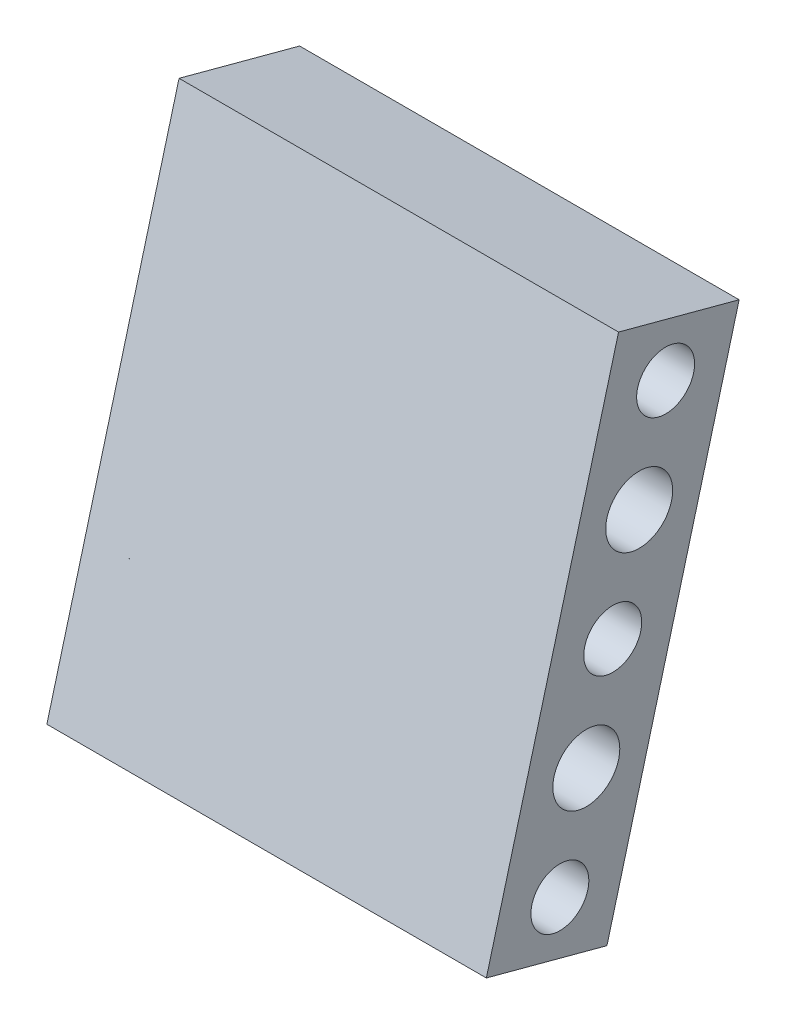
ISO-10303-21;
HEADER;
FILE_DESCRIPTION(('STEP AP214'),'2;1');
FILE_NAME('part.step','',(''),(''),'','','');
FILE_SCHEMA(('AUTOMOTIVE_DESIGN { 1 0 10303 214 1 1 1 1 }'));
ENDSEC;
DATA;
#1=APPLICATION_CONTEXT('core data for automotive mechanical design processes');
#2=APPLICATION_PROTOCOL_DEFINITION('international standard','automotive_design',2000,#1);
#3=PRODUCT_CONTEXT('',#1,'mechanical');
#4=PRODUCT('Part','Part','',(#3));
#5=PRODUCT_RELATED_PRODUCT_CATEGORY('part','',(#4));
#6=PRODUCT_DEFINITION_FORMATION('','',#4);
#7=PRODUCT_DEFINITION_CONTEXT('part definition',#1,'design');
#8=PRODUCT_DEFINITION('design','',#6,#7);
#9=PRODUCT_DEFINITION_SHAPE('','',#8);
#10=(LENGTH_UNIT() NAMED_UNIT(*) SI_UNIT(.MILLI.,.METRE.));
#11=(NAMED_UNIT(*) PLANE_ANGLE_UNIT() SI_UNIT($,.RADIAN.));
#12=(NAMED_UNIT(*) SI_UNIT($,.STERADIAN.) SOLID_ANGLE_UNIT());
#13=UNCERTAINTY_MEASURE_WITH_UNIT(LENGTH_MEASURE(1.E-05),#10,'distance_accuracy_value','');
#14=(GEOMETRIC_REPRESENTATION_CONTEXT(3) GLOBAL_UNCERTAINTY_ASSIGNED_CONTEXT((#13)) GLOBAL_UNIT_ASSIGNED_CONTEXT((#10,
#11,#12)) REPRESENTATION_CONTEXT('',''));
#15=CARTESIAN_POINT('',(0.,0.,0.));
#16=DIRECTION('',(0.,0.,1.));
#17=DIRECTION('',(1.,0.,0.));
#18=AXIS2_PLACEMENT_3D('',#15,#16,#17);
#19=CARTESIAN_POINT('',(19.3625,0.,0.));
#20=DIRECTION('',(-1.,0.,0.));
#21=DIRECTION('',(0.,0.,1.));
#22=AXIS2_PLACEMENT_3D('',#19,#20,#21);
#23=PLANE('',#22);
#24=CARTESIAN_POINT('',(19.3625,114.062981758306,-27.0267796246542));
#25=DIRECTION('',(1.,0.,0.));
#26=DIRECTION('',(0.,0.,-1.));
#27=AXIS2_PLACEMENT_3D('',#24,#25,#26);
#28=CIRCLE('',#27,2.55269999999999);
#29=CARTESIAN_POINT('',(19.3625,114.062981758306,-29.5794796246542));
#30=VERTEX_POINT('',#29);
#31=EDGE_CURVE('E143',#30,#30,#28,.T.);
#32=ORIENTED_EDGE('',*,*,#31,.F.);
#33=EDGE_LOOP('',(#32));
#34=FACE_BOUND('',#33,.T.);
#35=CARTESIAN_POINT('',(19.3625,96.6763168851028,-22.3680368128088));
#36=DIRECTION('',(1.,0.,0.));
#37=DIRECTION('',(0.,0.,-1.));
#38=AXIS2_PLACEMENT_3D('',#35,#36,#37);
#39=CIRCLE('',#38,2.55269999999999);
#40=CARTESIAN_POINT('',(19.3625,96.6763168851028,-24.9207368128088));
#41=VERTEX_POINT('',#40);
#42=EDGE_CURVE('E149',#41,#41,#39,.T.);
#43=ORIENTED_EDGE('',*,*,#42,.F.);
#44=EDGE_LOOP('',(#43));
#45=FACE_BOUND('',#44,.T.);
#46=CARTESIAN_POINT('',(19.3625,79.2896520118996,-17.7092940009634));
#47=DIRECTION('',(1.,0.,0.));
#48=DIRECTION('',(0.,0.,-1.));
#49=AXIS2_PLACEMENT_3D('',#46,#47,#48);
#50=CIRCLE('',#49,2.55269999999999);
#51=CARTESIAN_POINT('',(19.3625,79.2896520118996,-20.2619940009634));
#52=VERTEX_POINT('',#51);
#53=EDGE_CURVE('E155',#52,#52,#50,.T.);
#54=ORIENTED_EDGE('',*,*,#53,.F.);
#55=EDGE_LOOP('',(#54));
#56=FACE_BOUND('',#55,.T.);
#57=DIRECTION('',(0.,0.965925826289068,-0.258819045102521));
#58=VECTOR('',#57,1.);
#59=CARTESIAN_POINT('',(19.3625,76.3664905416626,-11.2320162534122));
#60=LINE('',#59,#58);
#61=CARTESIAN_POINT('',(19.3625,76.3664905416626,-11.2320162534122));
#62=VERTEX_POINT('',#61);
#63=CARTESIAN_POINT('',(19.3625,119.833152724671,-22.8788732830256));
#64=VERTEX_POINT('',#63);
#65=EDGE_CURVE('E162',#62,#64,#60,.T.);
#66=ORIENTED_EDGE('',*,*,#65,.F.);
#67=DIRECTION('',(0.,0.258819045102523,0.965925826289068));
#68=VECTOR('',#67,1.);
#69=CARTESIAN_POINT('',(19.3625,73.5194810455349,-21.857200342592));
#70=LINE('',#69,#68);
#71=CARTESIAN_POINT('',(19.3625,73.5194810455349,-21.857200342592));
#72=VERTEX_POINT('',#71);
#73=EDGE_CURVE('E169',#72,#62,#70,.T.);
#74=ORIENTED_EDGE('',*,*,#73,.F.);
#75=DIRECTION('',(0.,-0.965925826289068,0.258819045102521));
#76=VECTOR('',#75,1.);
#77=CARTESIAN_POINT('',(19.3625,116.986143228543,-33.5040573722054));
#78=LINE('',#77,#76);
#79=CARTESIAN_POINT('',(19.3625,116.986143228543,-33.5040573722054));
#80=VERTEX_POINT('',#79);
#81=EDGE_CURVE('E167',#80,#72,#78,.T.);
#82=ORIENTED_EDGE('',*,*,#81,.F.);
#83=DIRECTION('',(0.,-0.258819045102521,-0.965925826289068));
#84=VECTOR('',#83,1.);
#85=CARTESIAN_POINT('',(19.3625,119.833152724671,-22.8788732830256));
#86=LINE('',#85,#84);
#87=EDGE_CURVE('E164',#64,#80,#86,.T.);
#88=ORIENTED_EDGE('',*,*,#87,.F.);
#89=EDGE_LOOP('',(#66,#74,#82,#88));
#90=FACE_BOUND('',#89,.T.);
#91=CARTESIAN_POINT('',(19.3625,87.9829844485012,-20.0386654068861));
#92=DIRECTION('',(1.,0.,0.));
#93=DIRECTION('',(0.,0.,-1.));
#94=AXIS2_PLACEMENT_3D('',#91,#92,#93);
#95=CIRCLE('',#94,2.94999999999999);
#96=CARTESIAN_POINT('',(19.3625,87.9829844485012,-22.9886654068861));
#97=VERTEX_POINT('',#96);
#98=EDGE_CURVE('E197',#97,#97,#95,.T.);
#99=ORIENTED_EDGE('',*,*,#98,.F.);
#100=EDGE_LOOP('',(#99));
#101=FACE_BOUND('',#100,.T.);
#102=CARTESIAN_POINT('',(19.3625,105.369649321704,-24.6974082187315));
#103=DIRECTION('',(1.,0.,0.));
#104=DIRECTION('',(0.,0.,-1.));
#105=AXIS2_PLACEMENT_3D('',#102,#103,#104);
#106=CIRCLE('',#105,2.94999999999999);
#107=CARTESIAN_POINT('',(19.3625,105.369649321704,-27.6474082187315));
#108=VERTEX_POINT('',#107);
#109=EDGE_CURVE('E200',#108,#108,#106,.T.);
#110=ORIENTED_EDGE('',*,*,#109,.F.);
#111=EDGE_LOOP('',(#110));
#112=FACE_BOUND('',#111,.T.);
#113=ADVANCED_FACE('F49',(#34,#45,#56,#90,#101,#112),#23,.F.);
#114=CARTESIAN_POINT('',(19.3625,76.3664905416626,-11.2320162534122));
#115=DIRECTION('',(0.,0.258819045102521,0.965925826289068));
#116=DIRECTION('',(0.,-0.965925826289068,0.258819045102521));
#117=AXIS2_PLACEMENT_3D('',#114,#115,#116);
#118=PLANE('',#117);
#119=DIRECTION('',(0.,0.965925826289068,-0.258819045102521));
#120=VECTOR('',#119,1.);
#121=CARTESIAN_POINT('',(-19.3625,76.3664905416626,-11.2320162534122));
#122=LINE('',#121,#120);
#123=CARTESIAN_POINT('',(-19.3625,76.3664905416626,-11.2320162534122));
#124=VERTEX_POINT('',#123);
#125=CARTESIAN_POINT('',(-19.3625,119.833152724671,-22.8788732830256));
#126=VERTEX_POINT('',#125);
#127=EDGE_CURVE('E161',#124,#126,#122,.T.);
#128=ORIENTED_EDGE('',*,*,#127,.F.);
#129=DIRECTION('',(-1.,0.,0.));
#130=VECTOR('',#129,1.);
#131=CARTESIAN_POINT('',(19.3625,76.3664905416626,-11.2320162534122));
#132=LINE('',#131,#130);
#133=EDGE_CURVE('E11',#62,#124,#132,.T.);
#134=ORIENTED_EDGE('',*,*,#133,.F.);
#135=ORIENTED_EDGE('',*,*,#65,.T.);
#136=DIRECTION('',(-1.,0.,0.));
#137=VECTOR('',#136,1.);
#138=CARTESIAN_POINT('',(19.3625,119.833152724671,-22.8788732830256));
#139=LINE('',#138,#137);
#140=EDGE_CURVE('E94',#64,#126,#139,.T.);
#141=ORIENTED_EDGE('',*,*,#140,.T.);
#142=EDGE_LOOP('',(#128,#134,#135,#141));
#143=FACE_BOUND('',#142,.T.);
#144=ADVANCED_FACE('F51',(#143),#118,.T.);
#145=CARTESIAN_POINT('',(19.3625,73.5194810455349,-21.857200342592));
#146=DIRECTION('',(0.,-0.965925826289068,0.258819045102523));
#147=DIRECTION('',(0.,-0.258819045102523,-0.965925826289068));
#148=AXIS2_PLACEMENT_3D('',#145,#146,#147);
#149=PLANE('',#148);
#150=DIRECTION('',(0.,0.258819045102523,0.965925826289068));
#151=VECTOR('',#150,1.);
#152=CARTESIAN_POINT('',(-19.3625,73.5194810455349,-21.857200342592));
#153=LINE('',#152,#151);
#154=CARTESIAN_POINT('',(-19.3625,73.5194810455349,-21.857200342592));
#155=VERTEX_POINT('',#154);
#156=EDGE_CURVE('E165',#155,#124,#153,.T.);
#157=ORIENTED_EDGE('',*,*,#156,.F.);
#158=DIRECTION('',(-1.,0.,0.));
#159=VECTOR('',#158,1.);
#160=CARTESIAN_POINT('',(19.3625,73.5194810455349,-21.857200342592));
#161=LINE('',#160,#159);
#162=EDGE_CURVE('E59',#72,#155,#161,.T.);
#163=ORIENTED_EDGE('',*,*,#162,.F.);
#164=ORIENTED_EDGE('',*,*,#73,.T.);
#165=ORIENTED_EDGE('',*,*,#133,.T.);
#166=EDGE_LOOP('',(#157,#163,#164,#165));
#167=FACE_BOUND('',#166,.T.);
#168=ADVANCED_FACE('F185',(#167),#149,.T.);
#169=CARTESIAN_POINT('',(19.3625,116.986143228543,-33.5040573722054));
#170=DIRECTION('',(0.,-0.258819045102521,-0.965925826289068));
#171=DIRECTION('',(0.,0.965925826289068,-0.258819045102521));
#172=AXIS2_PLACEMENT_3D('',#169,#170,#171);
#173=PLANE('',#172);
#174=DIRECTION('',(0.,-0.965925826289068,0.258819045102521));
#175=VECTOR('',#174,1.);
#176=CARTESIAN_POINT('',(-19.3625,116.986143228543,-33.5040573722054));
#177=LINE('',#176,#175);
#178=CARTESIAN_POINT('',(-19.3625,116.986143228543,-33.5040573722054));
#179=VERTEX_POINT('',#178);
#180=EDGE_CURVE('E176',#179,#155,#177,.T.);
#181=ORIENTED_EDGE('',*,*,#180,.F.);
#182=DIRECTION('',(-1.,0.,0.));
#183=VECTOR('',#182,1.);
#184=CARTESIAN_POINT('',(19.3625,116.986143228543,-33.5040573722054));
#185=LINE('',#184,#183);
#186=EDGE_CURVE('E181',#80,#179,#185,.T.);
#187=ORIENTED_EDGE('',*,*,#186,.F.);
#188=ORIENTED_EDGE('',*,*,#81,.T.);
#189=ORIENTED_EDGE('',*,*,#162,.T.);
#190=EDGE_LOOP('',(#181,#187,#188,#189));
#191=FACE_BOUND('',#190,.T.);
#192=ADVANCED_FACE('F188',(#191),#173,.T.);
#193=CARTESIAN_POINT('',(19.3625,119.833152724671,-22.8788732830256));
#194=DIRECTION('',(0.,0.965925826289068,-0.258819045102521));
#195=DIRECTION('',(0.,0.258819045102521,0.965925826289068));
#196=AXIS2_PLACEMENT_3D('',#193,#194,#195);
#197=PLANE('',#196);
#198=DIRECTION('',(0.,-0.258819045102521,-0.965925826289068));
#199=VECTOR('',#198,1.);
#200=CARTESIAN_POINT('',(-19.3625,119.833152724671,-22.8788732830256));
#201=LINE('',#200,#199);
#202=EDGE_CURVE('E173',#126,#179,#201,.T.);
#203=ORIENTED_EDGE('',*,*,#202,.F.);
#204=ORIENTED_EDGE('',*,*,#140,.F.);
#205=ORIENTED_EDGE('',*,*,#87,.T.);
#206=ORIENTED_EDGE('',*,*,#186,.T.);
#207=EDGE_LOOP('',(#203,#204,#205,#206));
#208=FACE_BOUND('',#207,.T.);
#209=ADVANCED_FACE('F182',(#208),#197,.T.);
#210=CARTESIAN_POINT('',(-19.3625,0.,0.));
#211=DIRECTION('',(-1.,0.,0.));
#212=DIRECTION('',(0.,0.,1.));
#213=AXIS2_PLACEMENT_3D('',#210,#211,#212);
#214=PLANE('',#213);
#215=CARTESIAN_POINT('',(-19.3625,105.369649321704,-24.6974082187315));
#216=DIRECTION('',(-1.,0.,0.));
#217=DIRECTION('',(0.,0.,1.));
#218=AXIS2_PLACEMENT_3D('',#215,#216,#217);
#219=CIRCLE('',#218,2.94999999999999);
#220=CARTESIAN_POINT('',(-19.3625,105.369649321704,-21.7474082187315));
#221=VERTEX_POINT('',#220);
#222=EDGE_CURVE('E202',#221,#221,#219,.T.);
#223=ORIENTED_EDGE('',*,*,#222,.F.);
#224=EDGE_LOOP('',(#223));
#225=FACE_BOUND('',#224,.T.);
#226=CARTESIAN_POINT('',(-19.3625,87.9829844485012,-20.0386654068861));
#227=DIRECTION('',(-1.,0.,0.));
#228=DIRECTION('',(0.,0.,1.));
#229=AXIS2_PLACEMENT_3D('',#226,#227,#228);
#230=CIRCLE('',#229,2.94999999999999);
#231=CARTESIAN_POINT('',(-19.3625,87.9829844485012,-17.0886654068861));
#232=VERTEX_POINT('',#231);
#233=EDGE_CURVE('E53',#232,#232,#230,.T.);
#234=ORIENTED_EDGE('',*,*,#233,.F.);
#235=EDGE_LOOP('',(#234));
#236=FACE_BOUND('',#235,.T.);
#237=CARTESIAN_POINT('',(-19.3625,114.062981758306,-27.0267796246542));
#238=DIRECTION('',(-1.,0.,0.));
#239=DIRECTION('',(0.,0.,1.));
#240=AXIS2_PLACEMENT_3D('',#237,#238,#239);
#241=CIRCLE('',#240,2.55269999999999);
#242=CARTESIAN_POINT('',(-19.3625,114.062981758306,-24.4740796246542));
#243=VERTEX_POINT('',#242);
#244=EDGE_CURVE('E126',#243,#243,#241,.T.);
#245=ORIENTED_EDGE('',*,*,#244,.F.);
#246=EDGE_LOOP('',(#245));
#247=FACE_BOUND('',#246,.T.);
#248=CARTESIAN_POINT('',(-19.3625,96.6763168851028,-22.3680368128088));
#249=DIRECTION('',(-1.,0.,0.));
#250=DIRECTION('',(0.,0.,1.));
#251=AXIS2_PLACEMENT_3D('',#248,#249,#250);
#252=CIRCLE('',#251,2.55269999999999);
#253=CARTESIAN_POINT('',(-19.3625,96.6763168851028,-19.8153368128088));
#254=VERTEX_POINT('',#253);
#255=EDGE_CURVE('E125',#254,#254,#252,.T.);
#256=ORIENTED_EDGE('',*,*,#255,.F.);
#257=EDGE_LOOP('',(#256));
#258=FACE_BOUND('',#257,.T.);
#259=CARTESIAN_POINT('',(-19.3625,79.2896520118996,-17.7092940009634));
#260=DIRECTION('',(-1.,0.,0.));
#261=DIRECTION('',(0.,0.,1.));
#262=AXIS2_PLACEMENT_3D('',#259,#260,#261);
#263=CIRCLE('',#262,2.55269999999999);
#264=CARTESIAN_POINT('',(-19.3625,79.2896520118996,-15.1565940009634));
#265=VERTEX_POINT('',#264);
#266=EDGE_CURVE('E137',#265,#265,#263,.T.);
#267=ORIENTED_EDGE('',*,*,#266,.F.);
#268=EDGE_LOOP('',(#267));
#269=FACE_BOUND('',#268,.T.);
#270=ORIENTED_EDGE('',*,*,#127,.T.);
#271=ORIENTED_EDGE('',*,*,#202,.T.);
#272=ORIENTED_EDGE('',*,*,#180,.T.);
#273=ORIENTED_EDGE('',*,*,#156,.T.);
#274=EDGE_LOOP('',(#270,#271,#272,#273));
#275=FACE_BOUND('',#274,.T.);
#276=ADVANCED_FACE('F184',(#225,#236,#247,#258,#269,#275),#214,.T.);
#277=CARTESIAN_POINT('',(2.8525,79.2896520118996,-17.7092940009634));
#278=DIRECTION('',(1.,0.,0.));
#279=DIRECTION('',(0.,0.,-1.));
#280=AXIS2_PLACEMENT_3D('',#277,#278,#279);
#281=CONICAL_SURFACE('',#280,2.55269999999999,1.02974425867665);
#282=CARTESIAN_POINT('',(1.31868309780835,79.2896520118996,-17.7092940009634));
#283=VERTEX_POINT('',#282);
#284=VERTEX_LOOP('',#283);
#285=FACE_BOUND('',#284,.T.);
#286=CARTESIAN_POINT('',(2.8525,79.2896520118996,-17.7092940009634));
#287=DIRECTION('',(1.,0.,0.));
#288=DIRECTION('',(0.,0.,-1.));
#289=AXIS2_PLACEMENT_3D('',#286,#287,#288);
#290=CIRCLE('',#289,2.55269999999999);
#291=CARTESIAN_POINT('',(2.8525,79.2896520118996,-20.2619940009634));
#292=VERTEX_POINT('',#291);
#293=EDGE_CURVE('E158',#292,#292,#290,.T.);
#294=ORIENTED_EDGE('',*,*,#293,.T.);
#295=EDGE_LOOP('',(#294));
#296=FACE_BOUND('',#295,.T.);
#297=ADVANCED_FACE('F214',(#285,#296),#281,.F.);
#298=CARTESIAN_POINT('',(19.3625,79.2896520118996,-17.7092940009634));
#299=DIRECTION('',(1.,0.,0.));
#300=DIRECTION('',(0.,0.,-1.));
#301=AXIS2_PLACEMENT_3D('',#298,#299,#300);
#302=CYLINDRICAL_SURFACE('',#301,2.55269999999999);
#303=ORIENTED_EDGE('',*,*,#293,.F.);
#304=EDGE_LOOP('',(#303));
#305=FACE_BOUND('',#304,.T.);
#306=ORIENTED_EDGE('',*,*,#53,.T.);
#307=EDGE_LOOP('',(#306));
#308=FACE_BOUND('',#307,.T.);
#309=ADVANCED_FACE('F256',(#305,#308),#302,.F.);
#310=CARTESIAN_POINT('',(2.8525,96.6763168851028,-22.3680368128088));
#311=DIRECTION('',(1.,0.,0.));
#312=DIRECTION('',(0.,0.,-1.));
#313=AXIS2_PLACEMENT_3D('',#310,#311,#312);
#314=CONICAL_SURFACE('',#313,2.55269999999999,1.02974425867665);
#315=CARTESIAN_POINT('',(1.31868309780835,96.6763168851028,-22.3680368128088));
#316=VERTEX_POINT('',#315);
#317=VERTEX_LOOP('',#316);
#318=FACE_BOUND('',#317,.T.);
#319=CARTESIAN_POINT('',(2.8525,96.6763168851028,-22.3680368128088));
#320=DIRECTION('',(1.,0.,0.));
#321=DIRECTION('',(0.,0.,-1.));
#322=AXIS2_PLACEMENT_3D('',#319,#320,#321);
#323=CIRCLE('',#322,2.55269999999999);
#324=CARTESIAN_POINT('',(2.8525,96.6763168851028,-24.9207368128088));
#325=VERTEX_POINT('',#324);
#326=EDGE_CURVE('E152',#325,#325,#323,.T.);
#327=ORIENTED_EDGE('',*,*,#326,.T.);
#328=EDGE_LOOP('',(#327));
#329=FACE_BOUND('',#328,.T.);
#330=ADVANCED_FACE('F252',(#318,#329),#314,.F.);
#331=CARTESIAN_POINT('',(19.3625,96.6763168851028,-22.3680368128088));
#332=DIRECTION('',(1.,0.,0.));
#333=DIRECTION('',(0.,0.,-1.));
#334=AXIS2_PLACEMENT_3D('',#331,#332,#333);
#335=CYLINDRICAL_SURFACE('',#334,2.55269999999999);
#336=ORIENTED_EDGE('',*,*,#326,.F.);
#337=EDGE_LOOP('',(#336));
#338=FACE_BOUND('',#337,.T.);
#339=ORIENTED_EDGE('',*,*,#42,.T.);
#340=EDGE_LOOP('',(#339));
#341=FACE_BOUND('',#340,.T.);
#342=ADVANCED_FACE('F248',(#338,#341),#335,.F.);
#343=CARTESIAN_POINT('',(2.8525,114.062981758306,-27.0267796246542));
#344=DIRECTION('',(1.,0.,0.));
#345=DIRECTION('',(0.,0.,-1.));
#346=AXIS2_PLACEMENT_3D('',#343,#344,#345);
#347=CONICAL_SURFACE('',#346,2.55269999999999,1.02974425867665);
#348=CARTESIAN_POINT('',(1.31868309780835,114.062981758306,-27.0267796246542));
#349=VERTEX_POINT('',#348);
#350=VERTEX_LOOP('',#349);
#351=FACE_BOUND('',#350,.T.);
#352=CARTESIAN_POINT('',(2.8525,114.062981758306,-27.0267796246542));
#353=DIRECTION('',(1.,0.,0.));
#354=DIRECTION('',(0.,0.,-1.));
#355=AXIS2_PLACEMENT_3D('',#352,#353,#354);
#356=CIRCLE('',#355,2.55269999999999);
#357=CARTESIAN_POINT('',(2.8525,114.062981758306,-29.5794796246542));
#358=VERTEX_POINT('',#357);
#359=EDGE_CURVE('E146',#358,#358,#356,.T.);
#360=ORIENTED_EDGE('',*,*,#359,.T.);
#361=EDGE_LOOP('',(#360));
#362=FACE_BOUND('',#361,.T.);
#363=ADVANCED_FACE('F244',(#351,#362),#347,.F.);
#364=CARTESIAN_POINT('',(19.3625,114.062981758306,-27.0267796246542));
#365=DIRECTION('',(1.,0.,0.));
#366=DIRECTION('',(0.,0.,-1.));
#367=AXIS2_PLACEMENT_3D('',#364,#365,#366);
#368=CYLINDRICAL_SURFACE('',#367,2.55269999999999);
#369=ORIENTED_EDGE('',*,*,#359,.F.);
#370=EDGE_LOOP('',(#369));
#371=FACE_BOUND('',#370,.T.);
#372=ORIENTED_EDGE('',*,*,#31,.T.);
#373=EDGE_LOOP('',(#372));
#374=FACE_BOUND('',#373,.T.);
#375=ADVANCED_FACE('F237',(#371,#374),#368,.F.);
#376=CARTESIAN_POINT('',(-2.8525,79.2896520118996,-17.7092940009634));
#377=DIRECTION('',(-1.,0.,0.));
#378=DIRECTION('',(0.,0.,1.));
#379=AXIS2_PLACEMENT_3D('',#376,#377,#378);
#380=CONICAL_SURFACE('',#379,2.55269999999999,1.02974425867665);
#381=CARTESIAN_POINT('',(-1.31868309780836,79.2896520118996,-17.7092940009634));
#382=VERTEX_POINT('',#381);
#383=VERTEX_LOOP('',#382);
#384=FACE_BOUND('',#383,.T.);
#385=CARTESIAN_POINT('',(-2.8525,79.2896520118996,-17.7092940009634));
#386=DIRECTION('',(-1.,0.,0.));
#387=DIRECTION('',(0.,0.,1.));
#388=AXIS2_PLACEMENT_3D('',#385,#386,#387);
#389=CIRCLE('',#388,2.55269999999999);
#390=CARTESIAN_POINT('',(-2.8525,79.2896520118996,-15.1565940009634));
#391=VERTEX_POINT('',#390);
#392=EDGE_CURVE('E140',#391,#391,#389,.T.);
#393=ORIENTED_EDGE('',*,*,#392,.T.);
#394=EDGE_LOOP('',(#393));
#395=FACE_BOUND('',#394,.T.);
#396=ADVANCED_FACE('F226',(#384,#395),#380,.F.);
#397=CARTESIAN_POINT('',(-19.3625,79.2896520118996,-17.7092940009634));
#398=DIRECTION('',(-1.,0.,0.));
#399=DIRECTION('',(0.,0.,1.));
#400=AXIS2_PLACEMENT_3D('',#397,#398,#399);
#401=CYLINDRICAL_SURFACE('',#400,2.55269999999999);
#402=ORIENTED_EDGE('',*,*,#392,.F.);
#403=EDGE_LOOP('',(#402));
#404=FACE_BOUND('',#403,.T.);
#405=ORIENTED_EDGE('',*,*,#266,.T.);
#406=EDGE_LOOP('',(#405));
#407=FACE_BOUND('',#406,.T.);
#408=ADVANCED_FACE('F223',(#404,#407),#401,.F.);
#409=CARTESIAN_POINT('',(-2.8525,96.6763168851028,-22.3680368128088));
#410=DIRECTION('',(-1.,0.,0.));
#411=DIRECTION('',(0.,0.,1.));
#412=AXIS2_PLACEMENT_3D('',#409,#410,#411);
#413=CONICAL_SURFACE('',#412,2.55269999999999,1.02974425867665);
#414=CARTESIAN_POINT('',(-1.31868309780836,96.6763168851028,-22.3680368128088));
#415=VERTEX_POINT('',#414);
#416=VERTEX_LOOP('',#415);
#417=FACE_BOUND('',#416,.T.);
#418=CARTESIAN_POINT('',(-2.8525,96.6763168851028,-22.3680368128088));
#419=DIRECTION('',(-1.,0.,0.));
#420=DIRECTION('',(0.,0.,1.));
#421=AXIS2_PLACEMENT_3D('',#418,#419,#420);
#422=CIRCLE('',#421,2.55269999999999);
#423=CARTESIAN_POINT('',(-2.8525,96.6763168851028,-19.8153368128088));
#424=VERTEX_POINT('',#423);
#425=EDGE_CURVE('E129',#424,#424,#422,.T.);
#426=ORIENTED_EDGE('',*,*,#425,.T.);
#427=EDGE_LOOP('',(#426));
#428=FACE_BOUND('',#427,.T.);
#429=ADVANCED_FACE('F225',(#417,#428),#413,.F.);
#430=CARTESIAN_POINT('',(-19.3625,96.6763168851028,-22.3680368128088));
#431=DIRECTION('',(-1.,0.,0.));
#432=DIRECTION('',(0.,0.,1.));
#433=AXIS2_PLACEMENT_3D('',#430,#431,#432);
#434=CYLINDRICAL_SURFACE('',#433,2.55269999999999);
#435=ORIENTED_EDGE('',*,*,#425,.F.);
#436=EDGE_LOOP('',(#435));
#437=FACE_BOUND('',#436,.T.);
#438=ORIENTED_EDGE('',*,*,#255,.T.);
#439=EDGE_LOOP('',(#438));
#440=FACE_BOUND('',#439,.T.);
#441=ADVANCED_FACE('F119',(#437,#440),#434,.F.);
#442=CARTESIAN_POINT('',(-2.8525,114.062981758306,-27.0267796246542));
#443=DIRECTION('',(-1.,0.,0.));
#444=DIRECTION('',(0.,0.,1.));
#445=AXIS2_PLACEMENT_3D('',#442,#443,#444);
#446=CONICAL_SURFACE('',#445,2.55269999999999,1.02974425867665);
#447=CARTESIAN_POINT('',(-1.31868309780836,114.062981758306,-27.0267796246542));
#448=VERTEX_POINT('',#447);
#449=VERTEX_LOOP('',#448);
#450=FACE_BOUND('',#449,.T.);
#451=CARTESIAN_POINT('',(-2.8525,114.062981758306,-27.0267796246542));
#452=DIRECTION('',(-1.,0.,0.));
#453=DIRECTION('',(0.,0.,1.));
#454=AXIS2_PLACEMENT_3D('',#451,#452,#453);
#455=CIRCLE('',#454,2.55269999999999);
#456=CARTESIAN_POINT('',(-2.8525,114.062981758306,-24.4740796246542));
#457=VERTEX_POINT('',#456);
#458=EDGE_CURVE('E123',#457,#457,#455,.T.);
#459=ORIENTED_EDGE('',*,*,#458,.T.);
#460=EDGE_LOOP('',(#459));
#461=FACE_BOUND('',#460,.T.);
#462=ADVANCED_FACE('F115',(#450,#461),#446,.F.);
#463=CARTESIAN_POINT('',(-19.3625,114.062981758306,-27.0267796246542));
#464=DIRECTION('',(-1.,0.,0.));
#465=DIRECTION('',(0.,0.,1.));
#466=AXIS2_PLACEMENT_3D('',#463,#464,#465);
#467=CYLINDRICAL_SURFACE('',#466,2.55269999999999);
#468=ORIENTED_EDGE('',*,*,#458,.F.);
#469=EDGE_LOOP('',(#468));
#470=FACE_BOUND('',#469,.T.);
#471=ORIENTED_EDGE('',*,*,#244,.T.);
#472=EDGE_LOOP('',(#471));
#473=FACE_BOUND('',#472,.T.);
#474=ADVANCED_FACE('F118',(#470,#473),#467,.F.);
#475=CARTESIAN_POINT('',(19.3625,87.9829844485012,-20.0386654068861));
#476=DIRECTION('',(1.,0.,0.));
#477=DIRECTION('',(0.,0.,-1.));
#478=AXIS2_PLACEMENT_3D('',#475,#476,#477);
#479=CYLINDRICAL_SURFACE('',#478,2.94999999999999);
#480=ORIENTED_EDGE('',*,*,#233,.T.);
#481=EDGE_LOOP('',(#480));
#482=FACE_BOUND('',#481,.T.);
#483=ORIENTED_EDGE('',*,*,#98,.T.);
#484=EDGE_LOOP('',(#483));
#485=FACE_BOUND('',#484,.T.);
#486=ADVANCED_FACE('F210',(#482,#485),#479,.F.);
#487=CARTESIAN_POINT('',(19.3625,105.369649321704,-24.6974082187315));
#488=DIRECTION('',(1.,0.,0.));
#489=DIRECTION('',(0.,0.,-1.));
#490=AXIS2_PLACEMENT_3D('',#487,#488,#489);
#491=CYLINDRICAL_SURFACE('',#490,2.94999999999999);
#492=ORIENTED_EDGE('',*,*,#222,.T.);
#493=EDGE_LOOP('',(#492));
#494=FACE_BOUND('',#493,.T.);
#495=ORIENTED_EDGE('',*,*,#109,.T.);
#496=EDGE_LOOP('',(#495));
#497=FACE_BOUND('',#496,.T.);
#498=ADVANCED_FACE('F384',(#494,#497),#491,.F.);
#499=CLOSED_SHELL('',(#113,#144,#168,#192,#209,#276,#297,#309,#330,#342,#363,#375,#396,#408,
#429,#441,#462,#474,#486,#498));
#500=MANIFOLD_SOLID_BREP('B2',#499);
#501=ADVANCED_BREP_SHAPE_REPRESENTATION('',(#18,#500),#14);
#502=SHAPE_DEFINITION_REPRESENTATION(#9,#501);
ENDSEC;
END-ISO-10303-21;
